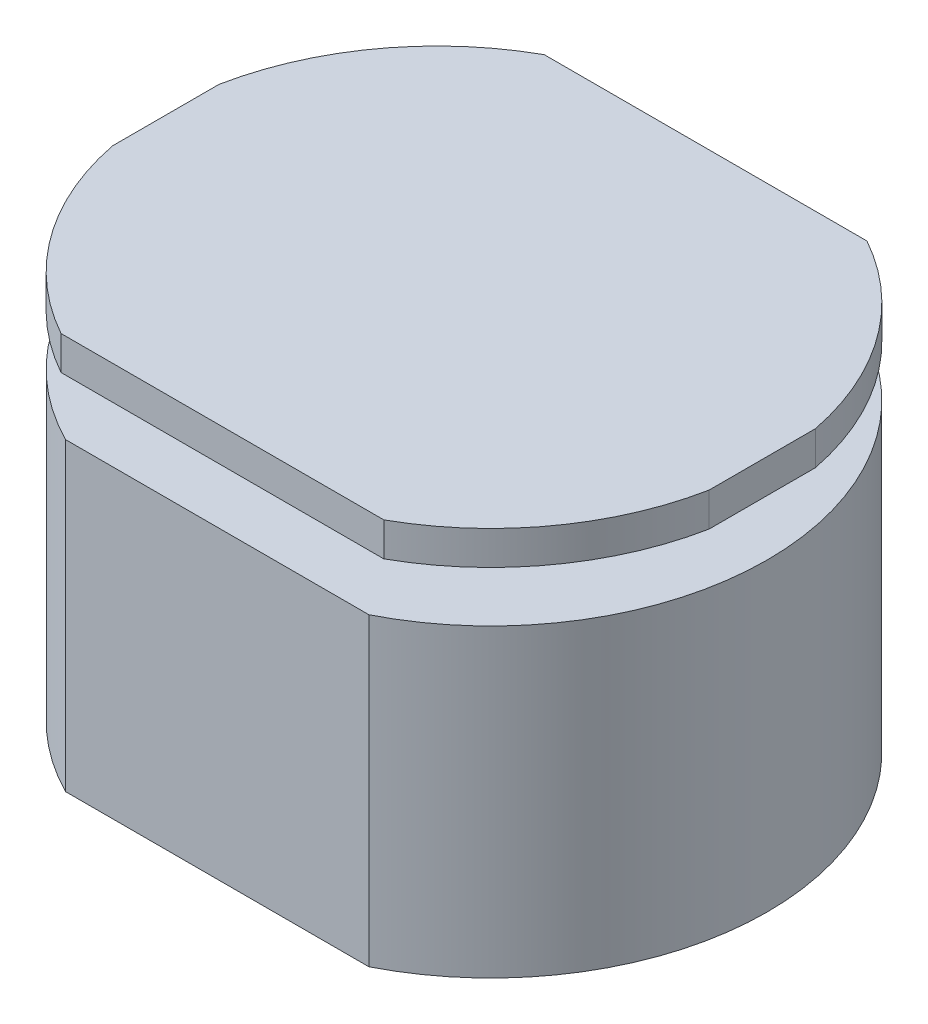
ISO-10303-21;
HEADER;
FILE_DESCRIPTION(('STEP AP214'),'2;1');
FILE_NAME('part.step','',(''),(''),'','','');
FILE_SCHEMA(('AUTOMOTIVE_DESIGN { 1 0 10303 214 1 1 1 1 }'));
ENDSEC;
DATA;
#1=APPLICATION_CONTEXT('core data for automotive mechanical design processes');
#2=APPLICATION_PROTOCOL_DEFINITION('international standard','automotive_design',2000,#1);
#3=PRODUCT_CONTEXT('',#1,'mechanical');
#4=PRODUCT('Part','Part','',(#3));
#5=PRODUCT_RELATED_PRODUCT_CATEGORY('part','',(#4));
#6=PRODUCT_DEFINITION_FORMATION('','',#4);
#7=PRODUCT_DEFINITION_CONTEXT('part definition',#1,'design');
#8=PRODUCT_DEFINITION('design','',#6,#7);
#9=PRODUCT_DEFINITION_SHAPE('','',#8);
#10=(LENGTH_UNIT() NAMED_UNIT(*) SI_UNIT(.MILLI.,.METRE.));
#11=(NAMED_UNIT(*) PLANE_ANGLE_UNIT() SI_UNIT($,.RADIAN.));
#12=(NAMED_UNIT(*) SI_UNIT($,.STERADIAN.) SOLID_ANGLE_UNIT());
#13=UNCERTAINTY_MEASURE_WITH_UNIT(LENGTH_MEASURE(1.E-05),#10,'distance_accuracy_value','');
#14=(GEOMETRIC_REPRESENTATION_CONTEXT(3) GLOBAL_UNCERTAINTY_ASSIGNED_CONTEXT((#13)) GLOBAL_UNIT_ASSIGNED_CONTEXT((#10,
#11,#12)) REPRESENTATION_CONTEXT('',''));
#15=CARTESIAN_POINT('',(0.,0.,0.));
#16=DIRECTION('',(0.,0.,1.));
#17=DIRECTION('',(1.,0.,0.));
#18=AXIS2_PLACEMENT_3D('',#15,#16,#17);
#19=CARTESIAN_POINT('',(0.,296.,0.));
#20=DIRECTION('',(0.,1.,0.));
#21=DIRECTION('',(0.,0.,1.));
#22=AXIS2_PLACEMENT_3D('',#19,#20,#21);
#23=PLANE('',#22);
#24=DIRECTION('',(-1.,0.,0.));
#25=VECTOR('',#24,1.);
#26=CARTESIAN_POINT('',(-110.,296.,-90.));
#27=LINE('',#26,#25);
#28=CARTESIAN_POINT('',(110.,296.,-90.));
#29=VERTEX_POINT('',#28);
#30=CARTESIAN_POINT('',(-110.,296.,-90.));
#31=VERTEX_POINT('',#30);
#32=EDGE_CURVE('E207',#29,#31,#27,.T.);
#33=ORIENTED_EDGE('',*,*,#32,.F.);
#34=DIRECTION('',(0.,0.,-1.));
#35=VECTOR('',#34,1.);
#36=CARTESIAN_POINT('',(110.,296.,-90.));
#37=LINE('',#36,#35);
#38=CARTESIAN_POINT('',(110.,296.,90.));
#39=VERTEX_POINT('',#38);
#40=EDGE_CURVE('E204',#39,#29,#37,.T.);
#41=ORIENTED_EDGE('',*,*,#40,.F.);
#42=DIRECTION('',(1.,0.,0.));
#43=VECTOR('',#42,1.);
#44=CARTESIAN_POINT('',(-110.,296.,90.));
#45=LINE('',#44,#43);
#46=CARTESIAN_POINT('',(-110.,296.,90.));
#47=VERTEX_POINT('',#46);
#48=EDGE_CURVE('E228',#47,#39,#45,.T.);
#49=ORIENTED_EDGE('',*,*,#48,.F.);
#50=DIRECTION('',(0.,0.,1.));
#51=VECTOR('',#50,1.);
#52=CARTESIAN_POINT('',(-110.,296.,-90.));
#53=LINE('',#52,#51);
#54=EDGE_CURVE('E239',#31,#47,#53,.T.);
#55=ORIENTED_EDGE('',*,*,#54,.F.);
#56=EDGE_LOOP('',(#33,#41,#49,#55));
#57=FACE_BOUND('',#56,.T.);
#58=DIRECTION('',(-1.,0.,0.));
#59=VECTOR('',#58,1.);
#60=CARTESIAN_POINT('',(294.5,296.,-239.5));
#61=LINE('',#60,#59);
#62=CARTESIAN_POINT('',(147.25,296.,-239.5));
#63=VERTEX_POINT('',#62);
#64=CARTESIAN_POINT('',(-147.25,296.,-239.5));
#65=VERTEX_POINT('',#64);
#66=EDGE_CURVE('E169',#63,#65,#61,.T.);
#67=ORIENTED_EDGE('',*,*,#66,.T.);
#68=CARTESIAN_POINT('',(-26.1033531409167,296.,0.));
#69=DIRECTION('',(0.,1.,0.));
#70=DIRECTION('',(0.,0.,1.));
#71=AXIS2_PLACEMENT_3D('',#68,#69,#70);
#72=CIRCLE('',#71,268.396646859083);
#73=CARTESIAN_POINT('',(-147.25,296.,239.5));
#74=VERTEX_POINT('',#73);
#75=EDGE_CURVE('E158',#65,#74,#72,.T.);
#76=ORIENTED_EDGE('',*,*,#75,.T.);
#77=DIRECTION('',(1.,0.,0.));
#78=VECTOR('',#77,1.);
#79=CARTESIAN_POINT('',(294.5,296.,239.5));
#80=LINE('',#79,#78);
#81=CARTESIAN_POINT('',(147.25,296.,239.5));
#82=VERTEX_POINT('',#81);
#83=EDGE_CURVE('E167',#74,#82,#80,.T.);
#84=ORIENTED_EDGE('',*,*,#83,.T.);
#85=CARTESIAN_POINT('',(26.1033531409167,296.,0.));
#86=DIRECTION('',(0.,1.,0.));
#87=DIRECTION('',(0.,0.,1.));
#88=AXIS2_PLACEMENT_3D('',#85,#86,#87);
#89=CIRCLE('',#88,268.396646859083);
#90=EDGE_CURVE('E216',#63,#82,#89,.F.);
#91=ORIENTED_EDGE('',*,*,#90,.F.);
#92=EDGE_LOOP('',(#67,#76,#84,#91));
#93=FACE_BOUND('',#92,.T.);
#94=ADVANCED_FACE('F34',(#57,#93),#23,.T.);
#95=CARTESIAN_POINT('',(0.,0.,0.));
#96=DIRECTION('',(0.,1.,0.));
#97=DIRECTION('',(0.,0.,1.));
#98=AXIS2_PLACEMENT_3D('',#95,#96,#97);
#99=PLANE('',#98);
#100=CARTESIAN_POINT('',(-26.1033531409167,0.,0.));
#101=DIRECTION('',(0.,1.,0.));
#102=DIRECTION('',(0.,0.,1.));
#103=AXIS2_PLACEMENT_3D('',#100,#101,#102);
#104=CIRCLE('',#103,268.396646859083);
#105=CARTESIAN_POINT('',(-147.25,0.,239.5));
#106=VERTEX_POINT('',#105);
#107=CARTESIAN_POINT('',(-147.25,0.,-239.5));
#108=VERTEX_POINT('',#107);
#109=EDGE_CURVE('E56',#106,#108,#104,.F.);
#110=ORIENTED_EDGE('',*,*,#109,.T.);
#111=DIRECTION('',(-1.,0.,0.));
#112=VECTOR('',#111,1.);
#113=CARTESIAN_POINT('',(294.5,0.,-239.5));
#114=LINE('',#113,#112);
#115=CARTESIAN_POINT('',(147.25,0.,-239.5));
#116=VERTEX_POINT('',#115);
#117=EDGE_CURVE('E149',#116,#108,#114,.T.);
#118=ORIENTED_EDGE('',*,*,#117,.F.);
#119=CARTESIAN_POINT('',(26.1033531409167,0.,0.));
#120=DIRECTION('',(0.,1.,0.));
#121=DIRECTION('',(0.,0.,1.));
#122=AXIS2_PLACEMENT_3D('',#119,#120,#121);
#123=CIRCLE('',#122,268.396646859083);
#124=CARTESIAN_POINT('',(147.25,0.,239.5));
#125=VERTEX_POINT('',#124);
#126=EDGE_CURVE('E298',#125,#116,#123,.T.);
#127=ORIENTED_EDGE('',*,*,#126,.F.);
#128=DIRECTION('',(1.,0.,0.));
#129=VECTOR('',#128,1.);
#130=CARTESIAN_POINT('',(294.5,0.,239.5));
#131=LINE('',#130,#129);
#132=EDGE_CURVE('E150',#106,#125,#131,.T.);
#133=ORIENTED_EDGE('',*,*,#132,.F.);
#134=EDGE_LOOP('',(#110,#118,#127,#133));
#135=FACE_BOUND('',#134,.T.);
#136=ADVANCED_FACE('F146',(#135),#99,.F.);
#137=CARTESIAN_POINT('',(0.,345.2,0.));
#138=DIRECTION('',(0.,1.,0.));
#139=DIRECTION('',(0.,0.,1.));
#140=AXIS2_PLACEMENT_3D('',#137,#138,#139);
#141=PLANE('',#140);
#142=DIRECTION('',(1.,0.,0.));
#143=VECTOR('',#142,1.);
#144=CARTESIAN_POINT('',(-110.,345.2,90.));
#145=LINE('',#144,#143);
#146=CARTESIAN_POINT('',(-110.,345.2,90.));
#147=VERTEX_POINT('',#146);
#148=CARTESIAN_POINT('',(110.,345.2,90.));
#149=VERTEX_POINT('',#148);
#150=EDGE_CURVE('E234',#147,#149,#145,.T.);
#151=ORIENTED_EDGE('',*,*,#150,.T.);
#152=DIRECTION('',(0.,0.,-1.));
#153=VECTOR('',#152,1.);
#154=CARTESIAN_POINT('',(110.,345.2,-90.));
#155=LINE('',#154,#153);
#156=CARTESIAN_POINT('',(110.,345.2,-90.));
#157=VERTEX_POINT('',#156);
#158=EDGE_CURVE('E224',#149,#157,#155,.T.);
#159=ORIENTED_EDGE('',*,*,#158,.T.);
#160=DIRECTION('',(-1.,0.,0.));
#161=VECTOR('',#160,1.);
#162=CARTESIAN_POINT('',(-110.,345.2,-90.));
#163=LINE('',#162,#161);
#164=CARTESIAN_POINT('',(-110.,345.2,-90.));
#165=VERTEX_POINT('',#164);
#166=EDGE_CURVE('E227',#157,#165,#163,.T.);
#167=ORIENTED_EDGE('',*,*,#166,.T.);
#168=DIRECTION('',(0.,0.,1.));
#169=VECTOR('',#168,1.);
#170=CARTESIAN_POINT('',(-110.,345.2,-90.));
#171=LINE('',#170,#169);
#172=EDGE_CURVE('E231',#165,#147,#171,.T.);
#173=ORIENTED_EDGE('',*,*,#172,.T.);
#174=EDGE_LOOP('',(#151,#159,#167,#173));
#175=FACE_BOUND('',#174,.T.);
#176=CARTESIAN_POINT('',(-26.1033531409167,345.2,0.));
#177=DIRECTION('',(0.,1.,0.));
#178=DIRECTION('',(0.,0.,1.));
#179=AXIS2_PLACEMENT_3D('',#176,#177,#178);
#180=CIRCLE('',#179,268.396646859083);
#181=CARTESIAN_POINT('',(-156.665637301387,345.2,-234.5));
#182=VERTEX_POINT('',#181);
#183=CARTESIAN_POINT('',(-289.5,345.2,-51.5651672021999));
#184=VERTEX_POINT('',#183);
#185=EDGE_CURVE('E162',#182,#184,#180,.T.);
#186=ORIENTED_EDGE('',*,*,#185,.F.);
#187=DIRECTION('',(-1.,0.,0.));
#188=VECTOR('',#187,1.);
#189=CARTESIAN_POINT('',(-289.5,345.2,-234.5));
#190=LINE('',#189,#188);
#191=CARTESIAN_POINT('',(156.665637301387,345.2,-234.5));
#192=VERTEX_POINT('',#191);
#193=EDGE_CURVE('E215',#192,#182,#190,.T.);
#194=ORIENTED_EDGE('',*,*,#193,.F.);
#195=CARTESIAN_POINT('',(26.1033531409167,345.2,0.));
#196=DIRECTION('',(0.,1.,0.));
#197=DIRECTION('',(0.,0.,1.));
#198=AXIS2_PLACEMENT_3D('',#195,#196,#197);
#199=CIRCLE('',#198,268.396646859083);
#200=CARTESIAN_POINT('',(289.5,345.2,-51.5651672022005));
#201=VERTEX_POINT('',#200);
#202=EDGE_CURVE('E260',#192,#201,#199,.F.);
#203=ORIENTED_EDGE('',*,*,#202,.T.);
#204=DIRECTION('',(0.,0.,-1.));
#205=VECTOR('',#204,1.);
#206=CARTESIAN_POINT('',(289.5,345.2,-234.5));
#207=LINE('',#206,#205);
#208=CARTESIAN_POINT('',(289.5,345.2,51.5651672022004));
#209=VERTEX_POINT('',#208);
#210=EDGE_CURVE('E213',#209,#201,#207,.T.);
#211=ORIENTED_EDGE('',*,*,#210,.F.);
#212=CARTESIAN_POINT('',(26.1033531409167,345.2,0.));
#213=DIRECTION('',(0.,1.,0.));
#214=DIRECTION('',(0.,0.,1.));
#215=AXIS2_PLACEMENT_3D('',#212,#213,#214);
#216=CIRCLE('',#215,268.396646859083);
#217=CARTESIAN_POINT('',(156.665637301387,345.2,234.5));
#218=VERTEX_POINT('',#217);
#219=EDGE_CURVE('E291',#209,#218,#216,.F.);
#220=ORIENTED_EDGE('',*,*,#219,.T.);
#221=DIRECTION('',(1.,0.,0.));
#222=VECTOR('',#221,1.);
#223=CARTESIAN_POINT('',(-289.5,345.2,234.5));
#224=LINE('',#223,#222);
#225=CARTESIAN_POINT('',(-156.665637301387,345.2,234.5));
#226=VERTEX_POINT('',#225);
#227=EDGE_CURVE('E221',#226,#218,#224,.T.);
#228=ORIENTED_EDGE('',*,*,#227,.F.);
#229=CARTESIAN_POINT('',(-26.1033531409167,345.2,0.));
#230=DIRECTION('',(0.,1.,0.));
#231=DIRECTION('',(0.,0.,1.));
#232=AXIS2_PLACEMENT_3D('',#229,#230,#231);
#233=CIRCLE('',#232,268.396646859083);
#234=CARTESIAN_POINT('',(-289.5,345.2,51.5651672021999));
#235=VERTEX_POINT('',#234);
#236=EDGE_CURVE('E151',#235,#226,#233,.T.);
#237=ORIENTED_EDGE('',*,*,#236,.F.);
#238=DIRECTION('',(0.,0.,1.));
#239=VECTOR('',#238,1.);
#240=CARTESIAN_POINT('',(-289.5,345.2,-234.5));
#241=LINE('',#240,#239);
#242=EDGE_CURVE('E219',#184,#235,#241,.T.);
#243=ORIENTED_EDGE('',*,*,#242,.F.);
#244=EDGE_LOOP('',(#186,#194,#203,#211,#220,#228,#237,#243));
#245=FACE_BOUND('',#244,.T.);
#246=ADVANCED_FACE('F276',(#175,#245),#141,.F.);
#247=CARTESIAN_POINT('',(0.,378.,0.));
#248=DIRECTION('',(0.,1.,0.));
#249=DIRECTION('',(0.,0.,1.));
#250=AXIS2_PLACEMENT_3D('',#247,#248,#249);
#251=PLANE('',#250);
#252=DIRECTION('',(-1.,0.,0.));
#253=VECTOR('',#252,1.);
#254=CARTESIAN_POINT('',(-289.5,378.,-234.5));
#255=LINE('',#254,#253);
#256=CARTESIAN_POINT('',(156.665637301387,378.,-234.5));
#257=VERTEX_POINT('',#256);
#258=CARTESIAN_POINT('',(-156.665637301387,378.,-234.5));
#259=VERTEX_POINT('',#258);
#260=EDGE_CURVE('E209',#257,#259,#255,.T.);
#261=ORIENTED_EDGE('',*,*,#260,.T.);
#262=CARTESIAN_POINT('',(-26.1033531409167,378.,0.));
#263=DIRECTION('',(0.,1.,0.));
#264=DIRECTION('',(0.,0.,1.));
#265=AXIS2_PLACEMENT_3D('',#262,#263,#264);
#266=CIRCLE('',#265,268.396646859083);
#267=CARTESIAN_POINT('',(-289.5,378.,-51.5651672021996));
#268=VERTEX_POINT('',#267);
#269=EDGE_CURVE('E48',#259,#268,#266,.T.);
#270=ORIENTED_EDGE('',*,*,#269,.T.);
#271=DIRECTION('',(0.,0.,1.));
#272=VECTOR('',#271,1.);
#273=CARTESIAN_POINT('',(-289.5,378.,-234.5));
#274=LINE('',#273,#272);
#275=CARTESIAN_POINT('',(-289.5,378.,51.5651672021996));
#276=VERTEX_POINT('',#275);
#277=EDGE_CURVE('E199',#268,#276,#274,.T.);
#278=ORIENTED_EDGE('',*,*,#277,.T.);
#279=CARTESIAN_POINT('',(-26.1033531409167,378.,0.));
#280=DIRECTION('',(0.,1.,0.));
#281=DIRECTION('',(0.,0.,1.));
#282=AXIS2_PLACEMENT_3D('',#279,#280,#281);
#283=CIRCLE('',#282,268.396646859083);
#284=CARTESIAN_POINT('',(-156.665637301387,378.,234.5));
#285=VERTEX_POINT('',#284);
#286=EDGE_CURVE('E186',#276,#285,#283,.T.);
#287=ORIENTED_EDGE('',*,*,#286,.T.);
#288=DIRECTION('',(1.,0.,0.));
#289=VECTOR('',#288,1.);
#290=CARTESIAN_POINT('',(-289.5,378.,234.5));
#291=LINE('',#290,#289);
#292=CARTESIAN_POINT('',(156.665637301387,378.,234.5));
#293=VERTEX_POINT('',#292);
#294=EDGE_CURVE('E196',#285,#293,#291,.T.);
#295=ORIENTED_EDGE('',*,*,#294,.T.);
#296=CARTESIAN_POINT('',(26.1033531409167,378.,0.));
#297=DIRECTION('',(0.,1.,0.));
#298=DIRECTION('',(0.,0.,1.));
#299=AXIS2_PLACEMENT_3D('',#296,#297,#298);
#300=CIRCLE('',#299,268.396646859083);
#301=CARTESIAN_POINT('',(289.5,378.,51.5651672022001));
#302=VERTEX_POINT('',#301);
#303=EDGE_CURVE('E289',#302,#293,#300,.F.);
#304=ORIENTED_EDGE('',*,*,#303,.F.);
#305=DIRECTION('',(0.,0.,-1.));
#306=VECTOR('',#305,1.);
#307=CARTESIAN_POINT('',(289.5,378.,-234.5));
#308=LINE('',#307,#306);
#309=CARTESIAN_POINT('',(289.5,378.,-51.5651672022005));
#310=VERTEX_POINT('',#309);
#311=EDGE_CURVE('E223',#302,#310,#308,.T.);
#312=ORIENTED_EDGE('',*,*,#311,.T.);
#313=CARTESIAN_POINT('',(26.1033531409167,378.,0.));
#314=DIRECTION('',(0.,1.,0.));
#315=DIRECTION('',(0.,0.,1.));
#316=AXIS2_PLACEMENT_3D('',#313,#314,#315);
#317=CIRCLE('',#316,268.396646859083);
#318=EDGE_CURVE('E175',#257,#310,#317,.F.);
#319=ORIENTED_EDGE('',*,*,#318,.F.);
#320=EDGE_LOOP('',(#261,#270,#278,#287,#295,#304,#312,#319));
#321=FACE_BOUND('',#320,.T.);
#322=ADVANCED_FACE('F194',(#321),#251,.T.);
#323=CARTESIAN_POINT('',(-289.5,378.,-234.5));
#324=DIRECTION('',(1.,0.,0.));
#325=DIRECTION('',(0.,0.,-1.));
#326=AXIS2_PLACEMENT_3D('',#323,#324,#325);
#327=PLANE('',#326);
#328=DIRECTION('',(0.,1.,0.));
#329=VECTOR('',#328,1.);
#330=CARTESIAN_POINT('',(-289.5,-281.145536155209,-51.5651672021996));
#331=LINE('',#330,#329);
#332=EDGE_CURVE('E200',#184,#268,#331,.T.);
#333=ORIENTED_EDGE('',*,*,#332,.F.);
#334=ORIENTED_EDGE('',*,*,#242,.T.);
#335=DIRECTION('',(0.,1.,0.));
#336=VECTOR('',#335,1.);
#337=CARTESIAN_POINT('',(-289.5,-281.145536155209,51.5651672021996));
#338=LINE('',#337,#336);
#339=EDGE_CURVE('E284',#276,#235,#338,.F.);
#340=ORIENTED_EDGE('',*,*,#339,.F.);
#341=ORIENTED_EDGE('',*,*,#277,.F.);
#342=EDGE_LOOP('',(#333,#334,#340,#341));
#343=FACE_BOUND('',#342,.T.);
#344=ADVANCED_FACE('F331',(#343),#327,.F.);
#345=CARTESIAN_POINT('',(294.5,296.,-239.5));
#346=DIRECTION('',(0.,0.,1.));
#347=DIRECTION('',(1.,0.,0.));
#348=AXIS2_PLACEMENT_3D('',#345,#346,#347);
#349=PLANE('',#348);
#350=DIRECTION('',(0.,1.,0.));
#351=VECTOR('',#350,1.);
#352=CARTESIAN_POINT('',(-147.25,-281.145536155209,-239.5));
#353=LINE('',#352,#351);
#354=EDGE_CURVE('E155',#108,#65,#353,.T.);
#355=ORIENTED_EDGE('',*,*,#354,.T.);
#356=ORIENTED_EDGE('',*,*,#66,.F.);
#357=DIRECTION('',(0.,1.,0.));
#358=VECTOR('',#357,1.);
#359=CARTESIAN_POINT('',(147.25,-281.145536155209,-239.5));
#360=LINE('',#359,#358);
#361=EDGE_CURVE('E166',#116,#63,#360,.T.);
#362=ORIENTED_EDGE('',*,*,#361,.F.);
#363=ORIENTED_EDGE('',*,*,#117,.T.);
#364=EDGE_LOOP('',(#355,#356,#362,#363));
#365=FACE_BOUND('',#364,.T.);
#366=ADVANCED_FACE('F165',(#365),#349,.F.);
#367=CARTESIAN_POINT('',(-289.5,378.,-234.5));
#368=DIRECTION('',(0.,0.,1.));
#369=DIRECTION('',(1.,0.,0.));
#370=AXIS2_PLACEMENT_3D('',#367,#368,#369);
#371=PLANE('',#370);
#372=DIRECTION('',(0.,1.,0.));
#373=VECTOR('',#372,1.);
#374=CARTESIAN_POINT('',(-156.665637301387,-281.145536155209,-234.5));
#375=LINE('',#374,#373);
#376=EDGE_CURVE('E11',#259,#182,#375,.F.);
#377=ORIENTED_EDGE('',*,*,#376,.F.);
#378=ORIENTED_EDGE('',*,*,#260,.F.);
#379=DIRECTION('',(0.,1.,0.));
#380=VECTOR('',#379,1.);
#381=CARTESIAN_POINT('',(156.665637301387,-281.145536155209,-234.5));
#382=LINE('',#381,#380);
#383=EDGE_CURVE('E269',#257,#192,#382,.F.);
#384=ORIENTED_EDGE('',*,*,#383,.T.);
#385=ORIENTED_EDGE('',*,*,#193,.T.);
#386=EDGE_LOOP('',(#377,#378,#384,#385));
#387=FACE_BOUND('',#386,.T.);
#388=ADVANCED_FACE('F268',(#387),#371,.F.);
#389=CARTESIAN_POINT('',(294.5,296.,239.5));
#390=DIRECTION('',(0.,0.,-1.));
#391=DIRECTION('',(-1.,0.,0.));
#392=AXIS2_PLACEMENT_3D('',#389,#390,#391);
#393=PLANE('',#392);
#394=DIRECTION('',(0.,1.,0.));
#395=VECTOR('',#394,1.);
#396=CARTESIAN_POINT('',(-147.25,-281.145536155209,239.5));
#397=LINE('',#396,#395);
#398=EDGE_CURVE('E152',#106,#74,#397,.T.);
#399=ORIENTED_EDGE('',*,*,#398,.F.);
#400=ORIENTED_EDGE('',*,*,#132,.T.);
#401=DIRECTION('',(0.,1.,0.));
#402=VECTOR('',#401,1.);
#403=CARTESIAN_POINT('',(147.25,-281.145536155209,239.5));
#404=LINE('',#403,#402);
#405=EDGE_CURVE('E287',#125,#82,#404,.T.);
#406=ORIENTED_EDGE('',*,*,#405,.T.);
#407=ORIENTED_EDGE('',*,*,#83,.F.);
#408=EDGE_LOOP('',(#399,#400,#406,#407));
#409=FACE_BOUND('',#408,.T.);
#410=ADVANCED_FACE('F36',(#409),#393,.F.);
#411=CARTESIAN_POINT('',(-289.5,378.,234.5));
#412=DIRECTION('',(0.,0.,-1.));
#413=DIRECTION('',(-1.,0.,0.));
#414=AXIS2_PLACEMENT_3D('',#411,#412,#413);
#415=PLANE('',#414);
#416=DIRECTION('',(0.,1.,0.));
#417=VECTOR('',#416,1.);
#418=CARTESIAN_POINT('',(-156.665637301387,-281.145536155209,234.5));
#419=LINE('',#418,#417);
#420=EDGE_CURVE('E42',#226,#285,#419,.T.);
#421=ORIENTED_EDGE('',*,*,#420,.F.);
#422=ORIENTED_EDGE('',*,*,#227,.T.);
#423=DIRECTION('',(0.,1.,0.));
#424=VECTOR('',#423,1.);
#425=CARTESIAN_POINT('',(156.665637301387,-281.145536155209,234.5));
#426=LINE('',#425,#424);
#427=EDGE_CURVE('E178',#218,#293,#426,.T.);
#428=ORIENTED_EDGE('',*,*,#427,.T.);
#429=ORIENTED_EDGE('',*,*,#294,.F.);
#430=EDGE_LOOP('',(#421,#422,#428,#429));
#431=FACE_BOUND('',#430,.T.);
#432=ADVANCED_FACE('F202',(#431),#415,.F.);
#433=CARTESIAN_POINT('',(110.,345.2,-90.));
#434=DIRECTION('',(-1.,0.,0.));
#435=DIRECTION('',(0.,0.,1.));
#436=AXIS2_PLACEMENT_3D('',#433,#434,#435);
#437=PLANE('',#436);
#438=ORIENTED_EDGE('',*,*,#40,.T.);
#439=DIRECTION('',(0.,-1.,0.));
#440=VECTOR('',#439,1.);
#441=CARTESIAN_POINT('',(110.,345.2,-90.));
#442=LINE('',#441,#440);
#443=EDGE_CURVE('E171',#157,#29,#442,.T.);
#444=ORIENTED_EDGE('',*,*,#443,.F.);
#445=ORIENTED_EDGE('',*,*,#158,.F.);
#446=DIRECTION('',(0.,-1.,0.));
#447=VECTOR('',#446,1.);
#448=CARTESIAN_POINT('',(110.,345.2,90.));
#449=LINE('',#448,#447);
#450=EDGE_CURVE('E236',#149,#39,#449,.T.);
#451=ORIENTED_EDGE('',*,*,#450,.T.);
#452=EDGE_LOOP('',(#438,#444,#445,#451));
#453=FACE_BOUND('',#452,.T.);
#454=ADVANCED_FACE('F328',(#453),#437,.F.);
#455=CARTESIAN_POINT('',(-110.,345.2,-90.));
#456=DIRECTION('',(0.,0.,1.));
#457=DIRECTION('',(1.,0.,0.));
#458=AXIS2_PLACEMENT_3D('',#455,#456,#457);
#459=PLANE('',#458);
#460=ORIENTED_EDGE('',*,*,#32,.T.);
#461=DIRECTION('',(0.,-1.,0.));
#462=VECTOR('',#461,1.);
#463=CARTESIAN_POINT('',(-110.,345.2,-90.));
#464=LINE('',#463,#462);
#465=EDGE_CURVE('E247',#165,#31,#464,.T.);
#466=ORIENTED_EDGE('',*,*,#465,.F.);
#467=ORIENTED_EDGE('',*,*,#166,.F.);
#468=ORIENTED_EDGE('',*,*,#443,.T.);
#469=EDGE_LOOP('',(#460,#466,#467,#468));
#470=FACE_BOUND('',#469,.T.);
#471=ADVANCED_FACE('F353',(#470),#459,.F.);
#472=CARTESIAN_POINT('',(-110.,345.2,-90.));
#473=DIRECTION('',(1.,0.,0.));
#474=DIRECTION('',(0.,0.,-1.));
#475=AXIS2_PLACEMENT_3D('',#472,#473,#474);
#476=PLANE('',#475);
#477=ORIENTED_EDGE('',*,*,#54,.T.);
#478=DIRECTION('',(0.,-1.,0.));
#479=VECTOR('',#478,1.);
#480=CARTESIAN_POINT('',(-110.,345.2,90.));
#481=LINE('',#480,#479);
#482=EDGE_CURVE('E245',#147,#47,#481,.T.);
#483=ORIENTED_EDGE('',*,*,#482,.F.);
#484=ORIENTED_EDGE('',*,*,#172,.F.);
#485=ORIENTED_EDGE('',*,*,#465,.T.);
#486=EDGE_LOOP('',(#477,#483,#484,#485));
#487=FACE_BOUND('',#486,.T.);
#488=ADVANCED_FACE('F350',(#487),#476,.F.);
#489=CARTESIAN_POINT('',(-110.,345.2,90.));
#490=DIRECTION('',(0.,0.,-1.));
#491=DIRECTION('',(-1.,0.,0.));
#492=AXIS2_PLACEMENT_3D('',#489,#490,#491);
#493=PLANE('',#492);
#494=ORIENTED_EDGE('',*,*,#48,.T.);
#495=ORIENTED_EDGE('',*,*,#450,.F.);
#496=ORIENTED_EDGE('',*,*,#150,.F.);
#497=ORIENTED_EDGE('',*,*,#482,.T.);
#498=EDGE_LOOP('',(#494,#495,#496,#497));
#499=FACE_BOUND('',#498,.T.);
#500=ADVANCED_FACE('F347',(#499),#493,.F.);
#501=CARTESIAN_POINT('',(289.5,378.,-234.5));
#502=DIRECTION('',(-1.,0.,0.));
#503=DIRECTION('',(0.,0.,1.));
#504=AXIS2_PLACEMENT_3D('',#501,#502,#503);
#505=PLANE('',#504);
#506=ORIENTED_EDGE('',*,*,#311,.F.);
#507=DIRECTION('',(0.,1.,0.));
#508=VECTOR('',#507,1.);
#509=CARTESIAN_POINT('',(289.5,-281.145536155209,51.5651672022001));
#510=LINE('',#509,#508);
#511=EDGE_CURVE('E294',#302,#209,#510,.F.);
#512=ORIENTED_EDGE('',*,*,#511,.T.);
#513=ORIENTED_EDGE('',*,*,#210,.T.);
#514=DIRECTION('',(0.,1.,0.));
#515=VECTOR('',#514,1.);
#516=CARTESIAN_POINT('',(289.5,-281.145536155209,-51.5651672022002));
#517=LINE('',#516,#515);
#518=EDGE_CURVE('E257',#201,#310,#517,.T.);
#519=ORIENTED_EDGE('',*,*,#518,.T.);
#520=EDGE_LOOP('',(#506,#512,#513,#519));
#521=FACE_BOUND('',#520,.T.);
#522=ADVANCED_FACE('F306',(#521),#505,.F.);
#523=CARTESIAN_POINT('',(26.1033531409167,-281.145536155209,0.));
#524=DIRECTION('',(0.,1.,0.));
#525=DIRECTION('',(0.,0.,1.));
#526=AXIS2_PLACEMENT_3D('',#523,#524,#525);
#527=CYLINDRICAL_SURFACE('',#526,268.396646859083);
#528=ORIENTED_EDGE('',*,*,#202,.F.);
#529=ORIENTED_EDGE('',*,*,#383,.F.);
#530=ORIENTED_EDGE('',*,*,#318,.T.);
#531=ORIENTED_EDGE('',*,*,#518,.F.);
#532=EDGE_LOOP('',(#528,#529,#530,#531));
#533=FACE_BOUND('',#532,.T.);
#534=ADVANCED_FACE('F303',(#533),#527,.T.);
#535=ORIENTED_EDGE('',*,*,#90,.T.);
#536=ORIENTED_EDGE('',*,*,#405,.F.);
#537=ORIENTED_EDGE('',*,*,#126,.T.);
#538=ORIENTED_EDGE('',*,*,#361,.T.);
#539=EDGE_LOOP('',(#535,#536,#537,#538));
#540=FACE_BOUND('',#539,.T.);
#541=ADVANCED_FACE('F310',(#540),#527,.T.);
#542=ORIENTED_EDGE('',*,*,#303,.T.);
#543=ORIENTED_EDGE('',*,*,#427,.F.);
#544=ORIENTED_EDGE('',*,*,#219,.F.);
#545=ORIENTED_EDGE('',*,*,#511,.F.);
#546=EDGE_LOOP('',(#542,#543,#544,#545));
#547=FACE_BOUND('',#546,.T.);
#548=ADVANCED_FACE('F308',(#547),#527,.T.);
#549=CARTESIAN_POINT('',(-26.1033531409167,-281.145536155209,0.));
#550=DIRECTION('',(0.,1.,0.));
#551=DIRECTION('',(0.,0.,1.));
#552=AXIS2_PLACEMENT_3D('',#549,#550,#551);
#553=CYLINDRICAL_SURFACE('',#552,268.396646859083);
#554=ORIENTED_EDGE('',*,*,#339,.T.);
#555=ORIENTED_EDGE('',*,*,#236,.T.);
#556=ORIENTED_EDGE('',*,*,#420,.T.);
#557=ORIENTED_EDGE('',*,*,#286,.F.);
#558=EDGE_LOOP('',(#554,#555,#556,#557));
#559=FACE_BOUND('',#558,.T.);
#560=ADVANCED_FACE('F185',(#559),#553,.T.);
#561=ORIENTED_EDGE('',*,*,#75,.F.);
#562=ORIENTED_EDGE('',*,*,#354,.F.);
#563=ORIENTED_EDGE('',*,*,#109,.F.);
#564=ORIENTED_EDGE('',*,*,#398,.T.);
#565=EDGE_LOOP('',(#561,#562,#563,#564));
#566=FACE_BOUND('',#565,.T.);
#567=ADVANCED_FACE('F156',(#566),#553,.T.);
#568=ORIENTED_EDGE('',*,*,#332,.T.);
#569=ORIENTED_EDGE('',*,*,#269,.F.);
#570=ORIENTED_EDGE('',*,*,#376,.T.);
#571=ORIENTED_EDGE('',*,*,#185,.T.);
#572=EDGE_LOOP('',(#568,#569,#570,#571));
#573=FACE_BOUND('',#572,.T.);
#574=ADVANCED_FACE('F272',(#573),#553,.T.);
#575=CLOSED_SHELL('',(#94,#136,#246,#322,#344,#366,#388,#410,#432,#454,#471,#488,#500,#522,#534,
#541,#548,#560,#567,#574));
#576=MANIFOLD_SOLID_BREP('B2',#575);
#577=ADVANCED_BREP_SHAPE_REPRESENTATION('',(#18,#576),#14);
#578=SHAPE_DEFINITION_REPRESENTATION(#9,#577);
ENDSEC;
END-ISO-10303-21;
